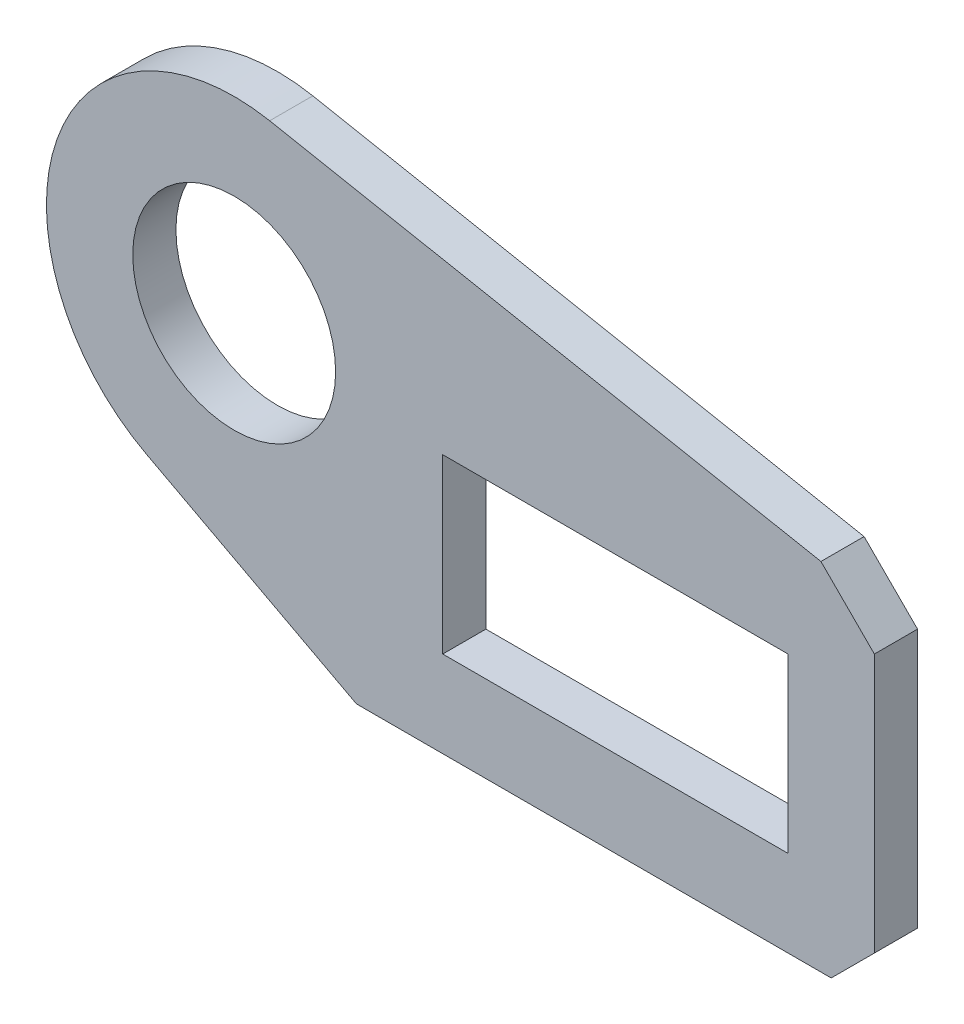
ISO-10303-21;
HEADER;
FILE_DESCRIPTION(('STEP AP214'),'2;1');
FILE_NAME('part.step','',(''),(''),'','','');
FILE_SCHEMA(('AUTOMOTIVE_DESIGN { 1 0 10303 214 1 1 1 1 }'));
ENDSEC;
DATA;
#1=APPLICATION_CONTEXT('core data for automotive mechanical design processes');
#2=APPLICATION_PROTOCOL_DEFINITION('international standard','automotive_design',2000,#1);
#3=PRODUCT_CONTEXT('',#1,'mechanical');
#4=PRODUCT('Part','Part','',(#3));
#5=PRODUCT_RELATED_PRODUCT_CATEGORY('part','',(#4));
#6=PRODUCT_DEFINITION_FORMATION('','',#4);
#7=PRODUCT_DEFINITION_CONTEXT('part definition',#1,'design');
#8=PRODUCT_DEFINITION('design','',#6,#7);
#9=PRODUCT_DEFINITION_SHAPE('','',#8);
#10=(LENGTH_UNIT() NAMED_UNIT(*) SI_UNIT(.MILLI.,.METRE.));
#11=(NAMED_UNIT(*) PLANE_ANGLE_UNIT() SI_UNIT($,.RADIAN.));
#12=(NAMED_UNIT(*) SI_UNIT($,.STERADIAN.) SOLID_ANGLE_UNIT());
#13=UNCERTAINTY_MEASURE_WITH_UNIT(LENGTH_MEASURE(1.E-05),#10,'distance_accuracy_value','');
#14=(GEOMETRIC_REPRESENTATION_CONTEXT(3) GLOBAL_UNCERTAINTY_ASSIGNED_CONTEXT((#13)) GLOBAL_UNIT_ASSIGNED_CONTEXT((#10,
#11,#12)) REPRESENTATION_CONTEXT('',''));
#15=CARTESIAN_POINT('',(0.,0.,0.));
#16=DIRECTION('',(0.,0.,1.));
#17=DIRECTION('',(1.,0.,0.));
#18=AXIS2_PLACEMENT_3D('',#15,#16,#17);
#19=CARTESIAN_POINT('',(-28.3154428574496,64.2270535232615,10.));
#20=DIRECTION('',(0.,0.,1.));
#21=DIRECTION('',(1.,0.,0.));
#22=AXIS2_PLACEMENT_3D('',#19,#20,#21);
#23=PLANE('',#22);
#24=DIRECTION('',(1.,0.,0.));
#25=VECTOR('',#24,1.);
#26=CARTESIAN_POINT('',(20.,20.,10.));
#27=LINE('',#26,#25);
#28=CARTESIAN_POINT('',(20.,20.,10.));
#29=VERTEX_POINT('',#28);
#30=CARTESIAN_POINT('',(100.,20.,10.));
#31=VERTEX_POINT('',#30);
#32=EDGE_CURVE('E128',#29,#31,#27,.T.);
#33=ORIENTED_EDGE('',*,*,#32,.F.);
#34=DIRECTION('',(0.,-1.,0.));
#35=VECTOR('',#34,1.);
#36=CARTESIAN_POINT('',(20.,60.,10.));
#37=LINE('',#36,#35);
#38=CARTESIAN_POINT('',(20.,60.,10.));
#39=VERTEX_POINT('',#38);
#40=EDGE_CURVE('E118',#39,#29,#37,.T.);
#41=ORIENTED_EDGE('',*,*,#40,.F.);
#42=DIRECTION('',(-1.,0.,0.));
#43=VECTOR('',#42,1.);
#44=CARTESIAN_POINT('',(20.,60.,10.));
#45=LINE('',#44,#43);
#46=CARTESIAN_POINT('',(100.,60.,10.));
#47=VERTEX_POINT('',#46);
#48=EDGE_CURVE('E144',#47,#39,#45,.T.);
#49=ORIENTED_EDGE('',*,*,#48,.F.);
#50=DIRECTION('',(0.,1.,0.));
#51=VECTOR('',#50,1.);
#52=CARTESIAN_POINT('',(100.,60.,10.));
#53=LINE('',#52,#51);
#54=EDGE_CURVE('E142',#31,#47,#53,.T.);
#55=ORIENTED_EDGE('',*,*,#54,.F.);
#56=EDGE_LOOP('',(#33,#41,#49,#55));
#57=FACE_BOUND('',#56,.T.);
#58=DIRECTION('',(0.,1.,0.));
#59=VECTOR('',#58,1.);
#60=CARTESIAN_POINT('',(120.,0.,10.));
#61=LINE('',#60,#59);
#62=CARTESIAN_POINT('',(120.,9.99999999999998,10.));
#63=VERTEX_POINT('',#62);
#64=CARTESIAN_POINT('',(120.,69.9999999999999,10.));
#65=VERTEX_POINT('',#64);
#66=EDGE_CURVE('E168',#63,#65,#61,.T.);
#67=ORIENTED_EDGE('',*,*,#66,.T.);
#68=DIRECTION('',(0.707106781186544,-0.707106781186551,0.));
#69=VECTOR('',#68,1.);
#70=CARTESIAN_POINT('',(48.7287518096452,141.271248190355,10.));
#71=LINE('',#70,#69);
#72=CARTESIAN_POINT('',(107.618838144379,82.3811618556211,10.));
#73=VERTEX_POINT('',#72);
#74=EDGE_CURVE('E41',#65,#73,#71,.F.);
#75=ORIENTED_EDGE('',*,*,#74,.T.);
#76=DIRECTION('',(-0.982003958298053,0.18886033433984,0.));
#77=VECTOR('',#76,1.);
#78=CARTESIAN_POINT('',(-20.1000183136666,106.944225709227,10.));
#79=LINE('',#78,#77);
#80=CARTESIAN_POINT('',(-20.1000183136666,106.944225709227,10.));
#81=VERTEX_POINT('',#80);
#82=EDGE_CURVE('E170',#73,#81,#79,.T.);
#83=ORIENTED_EDGE('',*,*,#82,.T.);
#84=CARTESIAN_POINT('',(-28.3154428574496,64.2270535232615,10.));
#85=DIRECTION('',(0.,0.,1.));
#86=DIRECTION('',(1.,0.,0.));
#87=AXIS2_PLACEMENT_3D('',#84,#85,#86);
#88=CIRCLE('',#87,43.5);
#89=CARTESIAN_POINT('',(-48.6787801459338,25.7876922580761,10.));
#90=VERTEX_POINT('',#89);
#91=EDGE_CURVE('E172',#81,#90,#88,.T.);
#92=ORIENTED_EDGE('',*,*,#91,.T.);
#93=DIRECTION('',(0.883663477360583,-0.46812269628699,0.));
#94=VECTOR('',#93,1.);
#95=CARTESIAN_POINT('',(-48.6787801459337,25.7876922580761,10.));
#96=LINE('',#95,#94);
#97=CARTESIAN_POINT('',(0.,0.,10.));
#98=VERTEX_POINT('',#97);
#99=EDGE_CURVE('E162',#90,#98,#96,.T.);
#100=ORIENTED_EDGE('',*,*,#99,.T.);
#101=DIRECTION('',(1.,0.,0.));
#102=VECTOR('',#101,1.);
#103=CARTESIAN_POINT('',(0.,0.,10.));
#104=LINE('',#103,#102);
#105=CARTESIAN_POINT('',(110.,0.,10.));
#106=VERTEX_POINT('',#105);
#107=EDGE_CURVE('E165',#98,#106,#104,.T.);
#108=ORIENTED_EDGE('',*,*,#107,.T.);
#109=DIRECTION('',(-0.707106781186549,-0.707106781186547,0.));
#110=VECTOR('',#109,1.);
#111=CARTESIAN_POINT('',(72.9558053329057,-37.0441946670942,10.));
#112=LINE('',#111,#110);
#113=EDGE_CURVE('E203',#106,#63,#112,.F.);
#114=ORIENTED_EDGE('',*,*,#113,.T.);
#115=EDGE_LOOP('',(#67,#75,#83,#92,#100,#108,#114));
#116=FACE_BOUND('',#115,.T.);
#117=CARTESIAN_POINT('',(-28.3154428574496,64.2270535232615,10.));
#118=DIRECTION('',(0.,0.,1.));
#119=DIRECTION('',(1.,0.,0.));
#120=AXIS2_PLACEMENT_3D('',#117,#118,#119);
#121=CIRCLE('',#120,23.5);
#122=CARTESIAN_POINT('',(-4.81544285744964,64.2270535232615,10.));
#123=VERTEX_POINT('',#122);
#124=EDGE_CURVE('E151',#123,#123,#121,.T.);
#125=ORIENTED_EDGE('',*,*,#124,.F.);
#126=EDGE_LOOP('',(#125));
#127=FACE_BOUND('',#126,.T.);
#128=ADVANCED_FACE('F33',(#57,#116,#127),#23,.T.);
#129=CARTESIAN_POINT('',(-28.3154428574496,64.2270535232615,0.));
#130=DIRECTION('',(0.,0.,1.));
#131=DIRECTION('',(1.,0.,0.));
#132=AXIS2_PLACEMENT_3D('',#129,#130,#131);
#133=PLANE('',#132);
#134=DIRECTION('',(0.,-1.,0.));
#135=VECTOR('',#134,1.);
#136=CARTESIAN_POINT('',(20.,60.,0.));
#137=LINE('',#136,#135);
#138=CARTESIAN_POINT('',(20.,60.,0.));
#139=VERTEX_POINT('',#138);
#140=CARTESIAN_POINT('',(20.,20.,0.));
#141=VERTEX_POINT('',#140);
#142=EDGE_CURVE('E149',#139,#141,#137,.T.);
#143=ORIENTED_EDGE('',*,*,#142,.T.);
#144=DIRECTION('',(1.,0.,0.));
#145=VECTOR('',#144,1.);
#146=CARTESIAN_POINT('',(20.,20.,0.));
#147=LINE('',#146,#145);
#148=CARTESIAN_POINT('',(100.,20.,0.));
#149=VERTEX_POINT('',#148);
#150=EDGE_CURVE('E135',#141,#149,#147,.T.);
#151=ORIENTED_EDGE('',*,*,#150,.T.);
#152=DIRECTION('',(0.,1.,0.));
#153=VECTOR('',#152,1.);
#154=CARTESIAN_POINT('',(100.,60.,0.));
#155=LINE('',#154,#153);
#156=CARTESIAN_POINT('',(100.,60.,0.));
#157=VERTEX_POINT('',#156);
#158=EDGE_CURVE('E153',#149,#157,#155,.T.);
#159=ORIENTED_EDGE('',*,*,#158,.T.);
#160=DIRECTION('',(-1.,0.,0.));
#161=VECTOR('',#160,1.);
#162=CARTESIAN_POINT('',(20.,60.,0.));
#163=LINE('',#162,#161);
#164=EDGE_CURVE('E129',#157,#139,#163,.T.);
#165=ORIENTED_EDGE('',*,*,#164,.T.);
#166=EDGE_LOOP('',(#143,#151,#159,#165));
#167=FACE_BOUND('',#166,.T.);
#168=DIRECTION('',(-0.982003958298053,0.18886033433984,0.));
#169=VECTOR('',#168,1.);
#170=CARTESIAN_POINT('',(-20.1000183136666,106.944225709227,0.));
#171=LINE('',#170,#169);
#172=CARTESIAN_POINT('',(107.618838144379,82.3811618556212,0.));
#173=VERTEX_POINT('',#172);
#174=CARTESIAN_POINT('',(-20.1000183136666,106.944225709227,0.));
#175=VERTEX_POINT('',#174);
#176=EDGE_CURVE('E181',#173,#175,#171,.T.);
#177=ORIENTED_EDGE('',*,*,#176,.F.);
#178=DIRECTION('',(-0.707106781186544,0.707106781186551,0.));
#179=VECTOR('',#178,1.);
#180=CARTESIAN_POINT('',(107.618838144379,82.3811618556211,0.));
#181=LINE('',#180,#179);
#182=CARTESIAN_POINT('',(120.,69.9999999999999,0.));
#183=VERTEX_POINT('',#182);
#184=EDGE_CURVE('E197',#173,#183,#181,.F.);
#185=ORIENTED_EDGE('',*,*,#184,.T.);
#186=DIRECTION('',(0.,1.,0.));
#187=VECTOR('',#186,1.);
#188=CARTESIAN_POINT('',(120.,0.,0.));
#189=LINE('',#188,#187);
#190=CARTESIAN_POINT('',(120.,10.,0.));
#191=VERTEX_POINT('',#190);
#192=EDGE_CURVE('E179',#191,#183,#189,.T.);
#193=ORIENTED_EDGE('',*,*,#192,.F.);
#194=DIRECTION('',(0.707106781186549,0.707106781186547,0.));
#195=VECTOR('',#194,1.);
#196=CARTESIAN_POINT('',(120.,10.,0.));
#197=LINE('',#196,#195);
#198=CARTESIAN_POINT('',(110.,0.,0.));
#199=VERTEX_POINT('',#198);
#200=EDGE_CURVE('E195',#191,#199,#197,.F.);
#201=ORIENTED_EDGE('',*,*,#200,.T.);
#202=DIRECTION('',(1.,0.,0.));
#203=VECTOR('',#202,1.);
#204=CARTESIAN_POINT('',(0.,0.,0.));
#205=LINE('',#204,#203);
#206=CARTESIAN_POINT('',(0.,0.,0.));
#207=VERTEX_POINT('',#206);
#208=EDGE_CURVE('E177',#207,#199,#205,.T.);
#209=ORIENTED_EDGE('',*,*,#208,.F.);
#210=DIRECTION('',(0.883663477360583,-0.46812269628699,0.));
#211=VECTOR('',#210,1.);
#212=CARTESIAN_POINT('',(-48.6787801459337,25.7876922580761,0.));
#213=LINE('',#212,#211);
#214=CARTESIAN_POINT('',(-48.6787801459338,25.7876922580761,0.));
#215=VERTEX_POINT('',#214);
#216=EDGE_CURVE('E136',#215,#207,#213,.T.);
#217=ORIENTED_EDGE('',*,*,#216,.F.);
#218=CARTESIAN_POINT('',(-28.3154428574496,64.2270535232615,0.));
#219=DIRECTION('',(0.,0.,1.));
#220=DIRECTION('',(1.,0.,0.));
#221=AXIS2_PLACEMENT_3D('',#218,#219,#220);
#222=CIRCLE('',#221,43.5);
#223=EDGE_CURVE('E166',#175,#215,#222,.T.);
#224=ORIENTED_EDGE('',*,*,#223,.F.);
#225=EDGE_LOOP('',(#177,#185,#193,#201,#209,#217,#224));
#226=FACE_BOUND('',#225,.T.);
#227=CARTESIAN_POINT('',(-28.3154428574496,64.2270535232615,0.));
#228=DIRECTION('',(0.,0.,1.));
#229=DIRECTION('',(1.,0.,0.));
#230=AXIS2_PLACEMENT_3D('',#227,#228,#229);
#231=CIRCLE('',#230,23.5);
#232=CARTESIAN_POINT('',(-4.81544285744964,64.2270535232615,0.));
#233=VERTEX_POINT('',#232);
#234=EDGE_CURVE('E270',#233,#233,#231,.T.);
#235=ORIENTED_EDGE('',*,*,#234,.T.);
#236=EDGE_LOOP('',(#235));
#237=FACE_BOUND('',#236,.T.);
#238=ADVANCED_FACE('F217',(#167,#226,#237),#133,.F.);
#239=CARTESIAN_POINT('',(-48.6787801459337,25.7876922580761,10.));
#240=DIRECTION('',(0.46812269628699,0.883663477360583,0.));
#241=DIRECTION('',(-0.883663477360583,0.46812269628699,0.));
#242=AXIS2_PLACEMENT_3D('',#239,#240,#241);
#243=PLANE('',#242);
#244=ORIENTED_EDGE('',*,*,#216,.T.);
#245=DIRECTION('',(0.,0.,-1.));
#246=VECTOR('',#245,1.);
#247=CARTESIAN_POINT('',(0.,0.,10.));
#248=LINE('',#247,#246);
#249=EDGE_CURVE('E189',#98,#207,#248,.T.);
#250=ORIENTED_EDGE('',*,*,#249,.F.);
#251=ORIENTED_EDGE('',*,*,#99,.F.);
#252=DIRECTION('',(0.,0.,-1.));
#253=VECTOR('',#252,1.);
#254=CARTESIAN_POINT('',(-48.6787801459338,25.7876922580761,10.));
#255=LINE('',#254,#253);
#256=EDGE_CURVE('E174',#90,#215,#255,.T.);
#257=ORIENTED_EDGE('',*,*,#256,.T.);
#258=EDGE_LOOP('',(#244,#250,#251,#257));
#259=FACE_BOUND('',#258,.T.);
#260=ADVANCED_FACE('F229',(#259),#243,.F.);
#261=CARTESIAN_POINT('',(0.,0.,10.));
#262=DIRECTION('',(0.,1.,0.));
#263=DIRECTION('',(-1.,0.,0.));
#264=AXIS2_PLACEMENT_3D('',#261,#262,#263);
#265=PLANE('',#264);
#266=ORIENTED_EDGE('',*,*,#208,.T.);
#267=DIRECTION('',(0.,0.,1.));
#268=VECTOR('',#267,1.);
#269=CARTESIAN_POINT('',(110.,0.,10.));
#270=LINE('',#269,#268);
#271=EDGE_CURVE('E11',#199,#106,#270,.T.);
#272=ORIENTED_EDGE('',*,*,#271,.T.);
#273=ORIENTED_EDGE('',*,*,#107,.F.);
#274=ORIENTED_EDGE('',*,*,#249,.T.);
#275=EDGE_LOOP('',(#266,#272,#273,#274));
#276=FACE_BOUND('',#275,.T.);
#277=ADVANCED_FACE('F225',(#276),#265,.F.);
#278=CARTESIAN_POINT('',(120.,0.,10.));
#279=DIRECTION('',(-1.,0.,0.));
#280=DIRECTION('',(0.,-1.,0.));
#281=AXIS2_PLACEMENT_3D('',#278,#279,#280);
#282=PLANE('',#281);
#283=ORIENTED_EDGE('',*,*,#192,.T.);
#284=DIRECTION('',(0.,0.,1.));
#285=VECTOR('',#284,1.);
#286=CARTESIAN_POINT('',(120.,69.9999999999999,10.));
#287=LINE('',#286,#285);
#288=EDGE_CURVE('E54',#183,#65,#287,.T.);
#289=ORIENTED_EDGE('',*,*,#288,.T.);
#290=ORIENTED_EDGE('',*,*,#66,.F.);
#291=DIRECTION('',(0.,0.,-1.));
#292=VECTOR('',#291,1.);
#293=CARTESIAN_POINT('',(120.,10.,10.));
#294=LINE('',#293,#292);
#295=EDGE_CURVE('E199',#63,#191,#294,.T.);
#296=ORIENTED_EDGE('',*,*,#295,.T.);
#297=EDGE_LOOP('',(#283,#289,#290,#296));
#298=FACE_BOUND('',#297,.T.);
#299=ADVANCED_FACE('F220',(#298),#282,.F.);
#300=CARTESIAN_POINT('',(-20.1000183136666,106.944225709227,10.));
#301=DIRECTION('',(-0.18886033433984,-0.982003958298053,0.));
#302=DIRECTION('',(0.982003958298053,-0.18886033433984,0.));
#303=AXIS2_PLACEMENT_3D('',#300,#301,#302);
#304=PLANE('',#303);
#305=ORIENTED_EDGE('',*,*,#82,.F.);
#306=DIRECTION('',(0.,0.,-1.));
#307=VECTOR('',#306,1.);
#308=CARTESIAN_POINT('',(107.618838144379,82.3811618556211,10.));
#309=LINE('',#308,#307);
#310=EDGE_CURVE('E192',#73,#173,#309,.T.);
#311=ORIENTED_EDGE('',*,*,#310,.T.);
#312=ORIENTED_EDGE('',*,*,#176,.T.);
#313=DIRECTION('',(0.,0.,-1.));
#314=VECTOR('',#313,1.);
#315=CARTESIAN_POINT('',(-20.1000183136666,106.944225709227,10.));
#316=LINE('',#315,#314);
#317=EDGE_CURVE('E186',#81,#175,#316,.T.);
#318=ORIENTED_EDGE('',*,*,#317,.F.);
#319=EDGE_LOOP('',(#305,#311,#312,#318));
#320=FACE_BOUND('',#319,.T.);
#321=ADVANCED_FACE('F211',(#320),#304,.F.);
#322=CARTESIAN_POINT('',(-28.3154428574496,64.2270535232615,10.));
#323=DIRECTION('',(0.,0.,-1.));
#324=DIRECTION('',(-1.,0.,0.));
#325=AXIS2_PLACEMENT_3D('',#322,#323,#324);
#326=CYLINDRICAL_SURFACE('',#325,43.5);
#327=ORIENTED_EDGE('',*,*,#223,.T.);
#328=ORIENTED_EDGE('',*,*,#256,.F.);
#329=ORIENTED_EDGE('',*,*,#91,.F.);
#330=ORIENTED_EDGE('',*,*,#317,.T.);
#331=EDGE_LOOP('',(#327,#328,#329,#330));
#332=FACE_BOUND('',#331,.T.);
#333=ADVANCED_FACE('F232',(#332),#326,.T.);
#334=CARTESIAN_POINT('',(20.,60.,10.));
#335=DIRECTION('',(1.,0.,0.));
#336=DIRECTION('',(0.,1.,0.));
#337=AXIS2_PLACEMENT_3D('',#334,#335,#336);
#338=PLANE('',#337);
#339=ORIENTED_EDGE('',*,*,#142,.F.);
#340=DIRECTION('',(0.,0.,-1.));
#341=VECTOR('',#340,1.);
#342=CARTESIAN_POINT('',(20.,60.,10.));
#343=LINE('',#342,#341);
#344=EDGE_CURVE('E124',#39,#139,#343,.T.);
#345=ORIENTED_EDGE('',*,*,#344,.F.);
#346=ORIENTED_EDGE('',*,*,#40,.T.);
#347=DIRECTION('',(0.,0.,-1.));
#348=VECTOR('',#347,1.);
#349=CARTESIAN_POINT('',(20.,20.,10.));
#350=LINE('',#349,#348);
#351=EDGE_CURVE('E121',#29,#141,#350,.T.);
#352=ORIENTED_EDGE('',*,*,#351,.T.);
#353=EDGE_LOOP('',(#339,#345,#346,#352));
#354=FACE_BOUND('',#353,.T.);
#355=ADVANCED_FACE('F120',(#354),#338,.T.);
#356=CARTESIAN_POINT('',(20.,20.,10.));
#357=DIRECTION('',(0.,1.,0.));
#358=DIRECTION('',(-1.,0.,0.));
#359=AXIS2_PLACEMENT_3D('',#356,#357,#358);
#360=PLANE('',#359);
#361=ORIENTED_EDGE('',*,*,#150,.F.);
#362=ORIENTED_EDGE('',*,*,#351,.F.);
#363=ORIENTED_EDGE('',*,*,#32,.T.);
#364=DIRECTION('',(0.,0.,-1.));
#365=VECTOR('',#364,1.);
#366=CARTESIAN_POINT('',(100.,20.,10.));
#367=LINE('',#366,#365);
#368=EDGE_CURVE('E137',#31,#149,#367,.T.);
#369=ORIENTED_EDGE('',*,*,#368,.T.);
#370=EDGE_LOOP('',(#361,#362,#363,#369));
#371=FACE_BOUND('',#370,.T.);
#372=ADVANCED_FACE('F132',(#371),#360,.T.);
#373=CARTESIAN_POINT('',(100.,60.,10.));
#374=DIRECTION('',(-1.,0.,0.));
#375=DIRECTION('',(0.,0.,1.));
#376=AXIS2_PLACEMENT_3D('',#373,#374,#375);
#377=PLANE('',#376);
#378=ORIENTED_EDGE('',*,*,#158,.F.);
#379=ORIENTED_EDGE('',*,*,#368,.F.);
#380=ORIENTED_EDGE('',*,*,#54,.T.);
#381=DIRECTION('',(0.,0.,-1.));
#382=VECTOR('',#381,1.);
#383=CARTESIAN_POINT('',(100.,60.,10.));
#384=LINE('',#383,#382);
#385=EDGE_CURVE('E159',#47,#157,#384,.T.);
#386=ORIENTED_EDGE('',*,*,#385,.T.);
#387=EDGE_LOOP('',(#378,#379,#380,#386));
#388=FACE_BOUND('',#387,.T.);
#389=ADVANCED_FACE('F251',(#388),#377,.T.);
#390=CARTESIAN_POINT('',(20.,60.,10.));
#391=DIRECTION('',(0.,-1.,0.));
#392=DIRECTION('',(1.,0.,0.));
#393=AXIS2_PLACEMENT_3D('',#390,#391,#392);
#394=PLANE('',#393);
#395=ORIENTED_EDGE('',*,*,#164,.F.);
#396=ORIENTED_EDGE('',*,*,#385,.F.);
#397=ORIENTED_EDGE('',*,*,#48,.T.);
#398=ORIENTED_EDGE('',*,*,#344,.T.);
#399=EDGE_LOOP('',(#395,#396,#397,#398));
#400=FACE_BOUND('',#399,.T.);
#401=ADVANCED_FACE('F254',(#400),#394,.T.);
#402=CARTESIAN_POINT('',(-28.3154428574496,64.2270535232615,10.));
#403=DIRECTION('',(0.,0.,-1.));
#404=DIRECTION('',(-1.,0.,0.));
#405=AXIS2_PLACEMENT_3D('',#402,#403,#404);
#406=CYLINDRICAL_SURFACE('',#405,23.5);
#407=ORIENTED_EDGE('',*,*,#124,.T.);
#408=EDGE_LOOP('',(#407));
#409=FACE_BOUND('',#408,.T.);
#410=ORIENTED_EDGE('',*,*,#234,.F.);
#411=EDGE_LOOP('',(#410));
#412=FACE_BOUND('',#411,.T.);
#413=ADVANCED_FACE('F258',(#409,#412),#406,.F.);
#414=CARTESIAN_POINT('',(107.618838144379,82.3811618556211,10.));
#415=DIRECTION('',(-0.707106781186551,-0.707106781186544,0.));
#416=DIRECTION('',(0.,0.,-1.));
#417=AXIS2_PLACEMENT_3D('',#414,#415,#416);
#418=PLANE('',#417);
#419=ORIENTED_EDGE('',*,*,#74,.F.);
#420=ORIENTED_EDGE('',*,*,#288,.F.);
#421=ORIENTED_EDGE('',*,*,#184,.F.);
#422=ORIENTED_EDGE('',*,*,#310,.F.);
#423=EDGE_LOOP('',(#419,#420,#421,#422));
#424=FACE_BOUND('',#423,.T.);
#425=ADVANCED_FACE('F214',(#424),#418,.F.);
#426=CARTESIAN_POINT('',(120.,10.,10.));
#427=DIRECTION('',(-0.707106781186547,0.707106781186549,0.));
#428=DIRECTION('',(0.,0.,-1.));
#429=AXIS2_PLACEMENT_3D('',#426,#427,#428);
#430=PLANE('',#429);
#431=ORIENTED_EDGE('',*,*,#113,.F.);
#432=ORIENTED_EDGE('',*,*,#271,.F.);
#433=ORIENTED_EDGE('',*,*,#200,.F.);
#434=ORIENTED_EDGE('',*,*,#295,.F.);
#435=EDGE_LOOP('',(#431,#432,#433,#434));
#436=FACE_BOUND('',#435,.T.);
#437=ADVANCED_FACE('F35',(#436),#430,.F.);
#438=CLOSED_SHELL('',(#128,#238,#260,#277,#299,#321,#333,#355,#372,#389,#401,#413,#425,#437));
#439=MANIFOLD_SOLID_BREP('B2',#438);
#440=ADVANCED_BREP_SHAPE_REPRESENTATION('',(#18,#439),#14);
#441=SHAPE_DEFINITION_REPRESENTATION(#9,#440);
ENDSEC;
END-ISO-10303-21;
